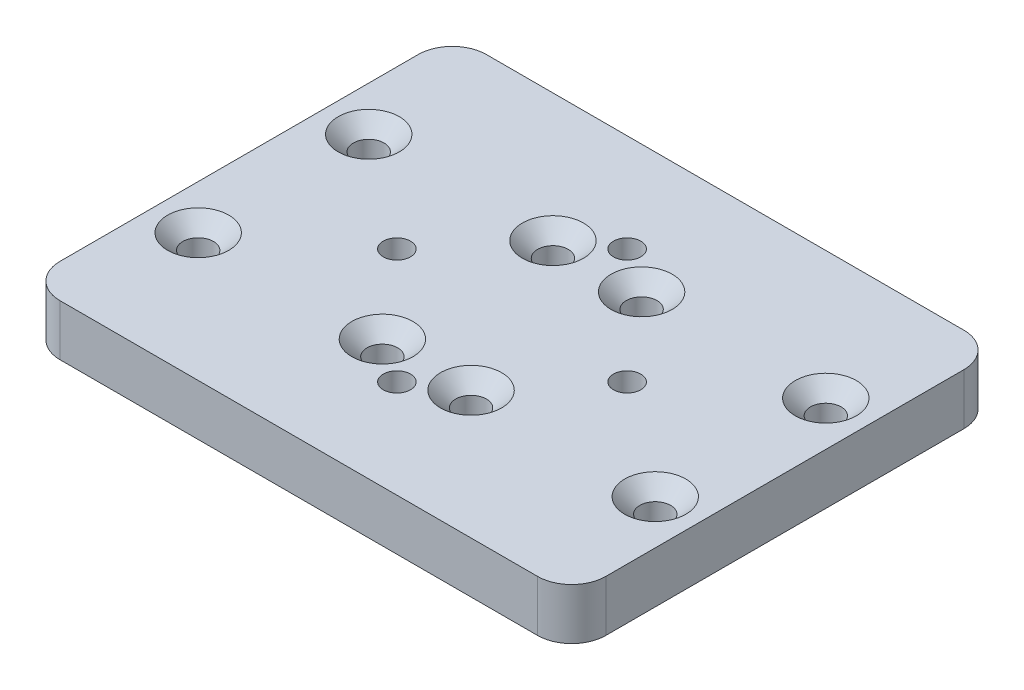
ISO-10303-21;
HEADER;
FILE_DESCRIPTION(('STEP AP214'),'2;1');
FILE_NAME('part.step','',(''),(''),'','','');
FILE_SCHEMA(('AUTOMOTIVE_DESIGN { 1 0 10303 214 1 1 1 1 }'));
ENDSEC;
DATA;
#1=APPLICATION_CONTEXT('core data for automotive mechanical design processes');
#2=APPLICATION_PROTOCOL_DEFINITION('international standard','automotive_design',2000,#1);
#3=PRODUCT_CONTEXT('',#1,'mechanical');
#4=PRODUCT('Part','Part','',(#3));
#5=PRODUCT_RELATED_PRODUCT_CATEGORY('part','',(#4));
#6=PRODUCT_DEFINITION_FORMATION('','',#4);
#7=PRODUCT_DEFINITION_CONTEXT('part definition',#1,'design');
#8=PRODUCT_DEFINITION('design','',#6,#7);
#9=PRODUCT_DEFINITION_SHAPE('','',#8);
#10=(LENGTH_UNIT() NAMED_UNIT(*) SI_UNIT(.MILLI.,.METRE.));
#11=(NAMED_UNIT(*) PLANE_ANGLE_UNIT() SI_UNIT($,.RADIAN.));
#12=(NAMED_UNIT(*) SI_UNIT($,.STERADIAN.) SOLID_ANGLE_UNIT());
#13=UNCERTAINTY_MEASURE_WITH_UNIT(LENGTH_MEASURE(1.E-05),#10,'distance_accuracy_value','');
#14=(GEOMETRIC_REPRESENTATION_CONTEXT(3) GLOBAL_UNCERTAINTY_ASSIGNED_CONTEXT((#13)) GLOBAL_UNIT_ASSIGNED_CONTEXT((#10,
#11,#12)) REPRESENTATION_CONTEXT('',''));
#15=CARTESIAN_POINT('',(0.,0.,0.));
#16=DIRECTION('',(0.,0.,1.));
#17=DIRECTION('',(1.,0.,0.));
#18=AXIS2_PLACEMENT_3D('',#15,#16,#17);
#19=CARTESIAN_POINT('',(-70.,15.,52.5));
#20=DIRECTION('',(0.,-1.,0.));
#21=DIRECTION('',(0.,0.,-1.));
#22=AXIS2_PLACEMENT_3D('',#19,#20,#21);
#23=CYLINDRICAL_SURFACE('',#22,9.99999999999999);
#24=CARTESIAN_POINT('',(-70.,0.,52.5));
#25=DIRECTION('',(0.,1.,0.));
#26=DIRECTION('',(0.,0.,-1.));
#27=AXIS2_PLACEMENT_3D('',#24,#25,#26);
#28=CIRCLE('',#27,9.99999999999999);
#29=CARTESIAN_POINT('',(-80.,0.,52.4999999999999));
#30=VERTEX_POINT('',#29);
#31=CARTESIAN_POINT('',(-70.,0.,62.5));
#32=VERTEX_POINT('',#31);
#33=EDGE_CURVE('E143',#30,#32,#28,.T.);
#34=ORIENTED_EDGE('',*,*,#33,.T.);
#35=DIRECTION('',(0.,-1.,0.));
#36=VECTOR('',#35,1.);
#37=CARTESIAN_POINT('',(-70.,15.,62.5));
#38=LINE('',#37,#36);
#39=CARTESIAN_POINT('',(-70.,15.,62.5));
#40=VERTEX_POINT('',#39);
#41=EDGE_CURVE('E11',#40,#32,#38,.T.);
#42=ORIENTED_EDGE('',*,*,#41,.F.);
#43=CARTESIAN_POINT('',(-70.,15.,52.5));
#44=DIRECTION('',(0.,1.,0.));
#45=DIRECTION('',(0.,0.,-1.));
#46=AXIS2_PLACEMENT_3D('',#43,#44,#45);
#47=CIRCLE('',#46,9.99999999999999);
#48=CARTESIAN_POINT('',(-80.,15.,52.4999999999999));
#49=VERTEX_POINT('',#48);
#50=EDGE_CURVE('E166',#49,#40,#47,.T.);
#51=ORIENTED_EDGE('',*,*,#50,.F.);
#52=DIRECTION('',(0.,-1.,0.));
#53=VECTOR('',#52,1.);
#54=CARTESIAN_POINT('',(-80.,15.,52.4999999999999));
#55=LINE('',#54,#53);
#56=EDGE_CURVE('E139',#49,#30,#55,.T.);
#57=ORIENTED_EDGE('',*,*,#56,.T.);
#58=EDGE_LOOP('',(#34,#42,#51,#57));
#59=FACE_BOUND('',#58,.T.);
#60=ADVANCED_FACE('F42',(#59),#23,.T.);
#61=CARTESIAN_POINT('',(-70.,15.,62.5));
#62=DIRECTION('',(0.,0.,-1.));
#63=DIRECTION('',(-1.,0.,0.));
#64=AXIS2_PLACEMENT_3D('',#61,#62,#63);
#65=PLANE('',#64);
#66=DIRECTION('',(1.,0.,0.));
#67=VECTOR('',#66,1.);
#68=CARTESIAN_POINT('',(-70.,0.,62.5));
#69=LINE('',#68,#67);
#70=CARTESIAN_POINT('',(69.9999999999999,0.,62.5));
#71=VERTEX_POINT('',#70);
#72=EDGE_CURVE('E147',#32,#71,#69,.T.);
#73=ORIENTED_EDGE('',*,*,#72,.T.);
#74=DIRECTION('',(0.,-1.,0.));
#75=VECTOR('',#74,1.);
#76=CARTESIAN_POINT('',(69.9999999999999,15.,62.5));
#77=LINE('',#76,#75);
#78=CARTESIAN_POINT('',(69.9999999999999,15.,62.5));
#79=VERTEX_POINT('',#78);
#80=EDGE_CURVE('E51',#79,#71,#77,.T.);
#81=ORIENTED_EDGE('',*,*,#80,.F.);
#82=DIRECTION('',(1.,0.,0.));
#83=VECTOR('',#82,1.);
#84=CARTESIAN_POINT('',(-70.,15.,62.5));
#85=LINE('',#84,#83);
#86=EDGE_CURVE('E102',#40,#79,#85,.T.);
#87=ORIENTED_EDGE('',*,*,#86,.F.);
#88=ORIENTED_EDGE('',*,*,#41,.T.);
#89=EDGE_LOOP('',(#73,#81,#87,#88));
#90=FACE_BOUND('',#89,.T.);
#91=ADVANCED_FACE('F390',(#90),#65,.F.);
#92=CARTESIAN_POINT('',(70.,15.,52.5));
#93=DIRECTION('',(0.,-1.,0.));
#94=DIRECTION('',(0.,0.,-1.));
#95=AXIS2_PLACEMENT_3D('',#92,#93,#94);
#96=CYLINDRICAL_SURFACE('',#95,9.99999999999999);
#97=CARTESIAN_POINT('',(70.,0.,52.5));
#98=DIRECTION('',(0.,1.,0.));
#99=DIRECTION('',(0.,0.,1.));
#100=AXIS2_PLACEMENT_3D('',#97,#98,#99);
#101=CIRCLE('',#100,9.99999999999999);
#102=CARTESIAN_POINT('',(80.,0.,52.4999999999999));
#103=VERTEX_POINT('',#102);
#104=EDGE_CURVE('E151',#71,#103,#101,.T.);
#105=ORIENTED_EDGE('',*,*,#104,.T.);
#106=DIRECTION('',(0.,-1.,0.));
#107=VECTOR('',#106,1.);
#108=CARTESIAN_POINT('',(80.,15.,52.4999999999999));
#109=LINE('',#108,#107);
#110=CARTESIAN_POINT('',(80.,15.,52.4999999999999));
#111=VERTEX_POINT('',#110);
#112=EDGE_CURVE('E177',#111,#103,#109,.T.);
#113=ORIENTED_EDGE('',*,*,#112,.F.);
#114=CARTESIAN_POINT('',(70.,15.,52.5));
#115=DIRECTION('',(0.,1.,0.));
#116=DIRECTION('',(0.,0.,1.));
#117=AXIS2_PLACEMENT_3D('',#114,#115,#116);
#118=CIRCLE('',#117,9.99999999999999);
#119=EDGE_CURVE('E187',#79,#111,#118,.T.);
#120=ORIENTED_EDGE('',*,*,#119,.F.);
#121=ORIENTED_EDGE('',*,*,#80,.T.);
#122=EDGE_LOOP('',(#105,#113,#120,#121));
#123=FACE_BOUND('',#122,.T.);
#124=ADVANCED_FACE('F185',(#123),#96,.T.);
#125=CARTESIAN_POINT('',(80.,15.,52.4999999999999));
#126=DIRECTION('',(-1.,0.,0.));
#127=DIRECTION('',(0.,0.,1.));
#128=AXIS2_PLACEMENT_3D('',#125,#126,#127);
#129=PLANE('',#128);
#130=DIRECTION('',(0.,0.,-1.));
#131=VECTOR('',#130,1.);
#132=CARTESIAN_POINT('',(80.,0.,52.4999999999999));
#133=LINE('',#132,#131);
#134=CARTESIAN_POINT('',(80.,0.,-52.4999999999999));
#135=VERTEX_POINT('',#134);
#136=EDGE_CURVE('E154',#103,#135,#133,.T.);
#137=ORIENTED_EDGE('',*,*,#136,.T.);
#138=DIRECTION('',(0.,-1.,0.));
#139=VECTOR('',#138,1.);
#140=CARTESIAN_POINT('',(80.,15.,-52.4999999999999));
#141=LINE('',#140,#139);
#142=CARTESIAN_POINT('',(80.,15.,-52.4999999999999));
#143=VERTEX_POINT('',#142);
#144=EDGE_CURVE('E173',#143,#135,#141,.T.);
#145=ORIENTED_EDGE('',*,*,#144,.F.);
#146=DIRECTION('',(0.,0.,-1.));
#147=VECTOR('',#146,1.);
#148=CARTESIAN_POINT('',(80.,15.,52.4999999999999));
#149=LINE('',#148,#147);
#150=EDGE_CURVE('E200',#111,#143,#149,.T.);
#151=ORIENTED_EDGE('',*,*,#150,.F.);
#152=ORIENTED_EDGE('',*,*,#112,.T.);
#153=EDGE_LOOP('',(#137,#145,#151,#152));
#154=FACE_BOUND('',#153,.T.);
#155=ADVANCED_FACE('F195',(#154),#129,.F.);
#156=CARTESIAN_POINT('',(70.,15.,-52.5));
#157=DIRECTION('',(0.,-1.,0.));
#158=DIRECTION('',(0.,0.,-1.));
#159=AXIS2_PLACEMENT_3D('',#156,#157,#158);
#160=CYLINDRICAL_SURFACE('',#159,9.99999999999999);
#161=CARTESIAN_POINT('',(70.,0.,-52.5));
#162=DIRECTION('',(0.,1.,0.));
#163=DIRECTION('',(0.,0.,-1.));
#164=AXIS2_PLACEMENT_3D('',#161,#162,#163);
#165=CIRCLE('',#164,9.99999999999999);
#166=CARTESIAN_POINT('',(69.9999999999999,0.,-62.5));
#167=VERTEX_POINT('',#166);
#168=EDGE_CURVE('E157',#135,#167,#165,.T.);
#169=ORIENTED_EDGE('',*,*,#168,.T.);
#170=DIRECTION('',(0.,-1.,0.));
#171=VECTOR('',#170,1.);
#172=CARTESIAN_POINT('',(69.9999999999999,15.,-62.5));
#173=LINE('',#172,#171);
#174=CARTESIAN_POINT('',(69.9999999999999,15.,-62.5));
#175=VERTEX_POINT('',#174);
#176=EDGE_CURVE('E132',#175,#167,#173,.T.);
#177=ORIENTED_EDGE('',*,*,#176,.F.);
#178=CARTESIAN_POINT('',(70.,15.,-52.5));
#179=DIRECTION('',(0.,1.,0.));
#180=DIRECTION('',(0.,0.,-1.));
#181=AXIS2_PLACEMENT_3D('',#178,#179,#180);
#182=CIRCLE('',#181,9.99999999999999);
#183=EDGE_CURVE('E121',#143,#175,#182,.T.);
#184=ORIENTED_EDGE('',*,*,#183,.F.);
#185=ORIENTED_EDGE('',*,*,#144,.T.);
#186=EDGE_LOOP('',(#169,#177,#184,#185));
#187=FACE_BOUND('',#186,.T.);
#188=ADVANCED_FACE('F198',(#187),#160,.T.);
#189=CARTESIAN_POINT('',(-70.,15.,-62.5));
#190=DIRECTION('',(0.,0.,1.));
#191=DIRECTION('',(1.,0.,0.));
#192=AXIS2_PLACEMENT_3D('',#189,#190,#191);
#193=PLANE('',#192);
#194=DIRECTION('',(-1.,0.,0.));
#195=VECTOR('',#194,1.);
#196=CARTESIAN_POINT('',(-70.,0.,-62.5));
#197=LINE('',#196,#195);
#198=CARTESIAN_POINT('',(-70.,0.,-62.5));
#199=VERTEX_POINT('',#198);
#200=EDGE_CURVE('E130',#167,#199,#197,.T.);
#201=ORIENTED_EDGE('',*,*,#200,.T.);
#202=DIRECTION('',(0.,-1.,0.));
#203=VECTOR('',#202,1.);
#204=CARTESIAN_POINT('',(-70.,15.,-62.5));
#205=LINE('',#204,#203);
#206=CARTESIAN_POINT('',(-70.,15.,-62.5));
#207=VERTEX_POINT('',#206);
#208=EDGE_CURVE('E127',#207,#199,#205,.T.);
#209=ORIENTED_EDGE('',*,*,#208,.F.);
#210=DIRECTION('',(-1.,0.,0.));
#211=VECTOR('',#210,1.);
#212=CARTESIAN_POINT('',(-70.,15.,-62.5));
#213=LINE('',#212,#211);
#214=EDGE_CURVE('E115',#175,#207,#213,.T.);
#215=ORIENTED_EDGE('',*,*,#214,.F.);
#216=ORIENTED_EDGE('',*,*,#176,.T.);
#217=EDGE_LOOP('',(#201,#209,#215,#216));
#218=FACE_BOUND('',#217,.T.);
#219=ADVANCED_FACE('F128',(#218),#193,.F.);
#220=CARTESIAN_POINT('',(-70.,15.,-52.5));
#221=DIRECTION('',(0.,-1.,0.));
#222=DIRECTION('',(0.,0.,-1.));
#223=AXIS2_PLACEMENT_3D('',#220,#221,#222);
#224=CYLINDRICAL_SURFACE('',#223,9.99999999999999);
#225=CARTESIAN_POINT('',(-70.,0.,-52.5));
#226=DIRECTION('',(0.,1.,0.));
#227=DIRECTION('',(0.,0.,-1.));
#228=AXIS2_PLACEMENT_3D('',#225,#226,#227);
#229=CIRCLE('',#228,9.99999999999999);
#230=CARTESIAN_POINT('',(-80.,0.,-52.4999999999999));
#231=VERTEX_POINT('',#230);
#232=EDGE_CURVE('E88',#199,#231,#229,.T.);
#233=ORIENTED_EDGE('',*,*,#232,.T.);
#234=DIRECTION('',(0.,-1.,0.));
#235=VECTOR('',#234,1.);
#236=CARTESIAN_POINT('',(-80.,15.,-52.4999999999999));
#237=LINE('',#236,#235);
#238=CARTESIAN_POINT('',(-80.,15.,-52.4999999999999));
#239=VERTEX_POINT('',#238);
#240=EDGE_CURVE('E133',#239,#231,#237,.T.);
#241=ORIENTED_EDGE('',*,*,#240,.F.);
#242=CARTESIAN_POINT('',(-70.,15.,-52.5));
#243=DIRECTION('',(0.,1.,0.));
#244=DIRECTION('',(0.,0.,-1.));
#245=AXIS2_PLACEMENT_3D('',#242,#243,#244);
#246=CIRCLE('',#245,9.99999999999999);
#247=EDGE_CURVE('E119',#207,#239,#246,.T.);
#248=ORIENTED_EDGE('',*,*,#247,.F.);
#249=ORIENTED_EDGE('',*,*,#208,.T.);
#250=EDGE_LOOP('',(#233,#241,#248,#249));
#251=FACE_BOUND('',#250,.T.);
#252=ADVANCED_FACE('F135',(#251),#224,.T.);
#253=CARTESIAN_POINT('',(-80.,15.,52.4999999999999));
#254=DIRECTION('',(1.,0.,0.));
#255=DIRECTION('',(0.,0.,-1.));
#256=AXIS2_PLACEMENT_3D('',#253,#254,#255);
#257=PLANE('',#256);
#258=DIRECTION('',(0.,0.,1.));
#259=VECTOR('',#258,1.);
#260=CARTESIAN_POINT('',(-80.,0.,52.4999999999999));
#261=LINE('',#260,#259);
#262=EDGE_CURVE('E94',#231,#30,#261,.T.);
#263=ORIENTED_EDGE('',*,*,#262,.T.);
#264=ORIENTED_EDGE('',*,*,#56,.F.);
#265=DIRECTION('',(0.,0.,1.));
#266=VECTOR('',#265,1.);
#267=CARTESIAN_POINT('',(-80.,15.,52.4999999999999));
#268=LINE('',#267,#266);
#269=EDGE_CURVE('E59',#239,#49,#268,.T.);
#270=ORIENTED_EDGE('',*,*,#269,.F.);
#271=ORIENTED_EDGE('',*,*,#240,.T.);
#272=EDGE_LOOP('',(#263,#264,#270,#271));
#273=FACE_BOUND('',#272,.T.);
#274=ADVANCED_FACE('F349',(#273),#257,.F.);
#275=CARTESIAN_POINT('',(-70.,15.,52.5));
#276=DIRECTION('',(0.,-1.,0.));
#277=DIRECTION('',(0.,0.,-1.));
#278=AXIS2_PLACEMENT_3D('',#275,#276,#277);
#279=PLANE('',#278);
#280=CARTESIAN_POINT('',(0.,15.,-33.75));
#281=DIRECTION('',(0.,1.,0.));
#282=DIRECTION('',(0.,0.,1.));
#283=AXIS2_PLACEMENT_3D('',#280,#281,#282);
#284=CIRCLE('',#283,4.);
#285=CARTESIAN_POINT('',(0.,15.,-29.75));
#286=VERTEX_POINT('',#285);
#287=EDGE_CURVE('E330',#286,#286,#284,.T.);
#288=ORIENTED_EDGE('',*,*,#287,.F.);
#289=EDGE_LOOP('',(#288));
#290=FACE_BOUND('',#289,.T.);
#291=CARTESIAN_POINT('',(33.75,15.,0.));
#292=DIRECTION('',(0.,1.,0.));
#293=DIRECTION('',(0.,0.,1.));
#294=AXIS2_PLACEMENT_3D('',#291,#292,#293);
#295=CIRCLE('',#294,4.00000000000001);
#296=CARTESIAN_POINT('',(33.75,15.,4.00000000000001));
#297=VERTEX_POINT('',#296);
#298=EDGE_CURVE('E322',#297,#297,#295,.T.);
#299=ORIENTED_EDGE('',*,*,#298,.F.);
#300=EDGE_LOOP('',(#299));
#301=FACE_BOUND('',#300,.T.);
#302=CARTESIAN_POINT('',(0.,15.,33.75));
#303=DIRECTION('',(0.,1.,0.));
#304=DIRECTION('',(0.,0.,1.));
#305=AXIS2_PLACEMENT_3D('',#302,#303,#304);
#306=CIRCLE('',#305,4.);
#307=CARTESIAN_POINT('',(0.,15.,37.75));
#308=VERTEX_POINT('',#307);
#309=EDGE_CURVE('E314',#308,#308,#306,.T.);
#310=ORIENTED_EDGE('',*,*,#309,.F.);
#311=EDGE_LOOP('',(#310));
#312=FACE_BOUND('',#311,.T.);
#313=CARTESIAN_POINT('',(-33.75,15.,0.));
#314=DIRECTION('',(0.,1.,0.));
#315=DIRECTION('',(0.,0.,1.));
#316=AXIS2_PLACEMENT_3D('',#313,#314,#315);
#317=CIRCLE('',#316,4.00000000000001);
#318=CARTESIAN_POINT('',(-33.75,15.,4.));
#319=VERTEX_POINT('',#318);
#320=EDGE_CURVE('E306',#319,#319,#317,.T.);
#321=ORIENTED_EDGE('',*,*,#320,.F.);
#322=EDGE_LOOP('',(#321));
#323=FACE_BOUND('',#322,.T.);
#324=CARTESIAN_POINT('',(-67.,15.,-25.));
#325=DIRECTION('',(0.,1.,0.));
#326=DIRECTION('',(0.,0.,1.));
#327=AXIS2_PLACEMENT_3D('',#324,#325,#326);
#328=CIRCLE('',#327,8.96);
#329=CARTESIAN_POINT('',(-67.,15.,-16.04));
#330=VERTEX_POINT('',#329);
#331=EDGE_CURVE('E301',#330,#330,#328,.T.);
#332=ORIENTED_EDGE('',*,*,#331,.F.);
#333=EDGE_LOOP('',(#332));
#334=FACE_BOUND('',#333,.T.);
#335=CARTESIAN_POINT('',(-13.,15.,-25.));
#336=DIRECTION('',(0.,1.,0.));
#337=DIRECTION('',(0.,0.,1.));
#338=AXIS2_PLACEMENT_3D('',#335,#336,#337);
#339=CIRCLE('',#338,8.96);
#340=CARTESIAN_POINT('',(-13.,15.,-16.04));
#341=VERTEX_POINT('',#340);
#342=EDGE_CURVE('E289',#341,#341,#339,.T.);
#343=ORIENTED_EDGE('',*,*,#342,.F.);
#344=EDGE_LOOP('',(#343));
#345=FACE_BOUND('',#344,.T.);
#346=CARTESIAN_POINT('',(-13.,15.,25.));
#347=DIRECTION('',(0.,1.,0.));
#348=DIRECTION('',(0.,0.,1.));
#349=AXIS2_PLACEMENT_3D('',#346,#347,#348);
#350=CIRCLE('',#349,8.96);
#351=CARTESIAN_POINT('',(-13.,15.,33.96));
#352=VERTEX_POINT('',#351);
#353=EDGE_CURVE('E277',#352,#352,#350,.T.);
#354=ORIENTED_EDGE('',*,*,#353,.F.);
#355=EDGE_LOOP('',(#354));
#356=FACE_BOUND('',#355,.T.);
#357=CARTESIAN_POINT('',(13.,15.,25.));
#358=DIRECTION('',(0.,1.,0.));
#359=DIRECTION('',(0.,0.,1.));
#360=AXIS2_PLACEMENT_3D('',#357,#358,#359);
#361=CIRCLE('',#360,8.96);
#362=CARTESIAN_POINT('',(13.,15.,33.96));
#363=VERTEX_POINT('',#362);
#364=EDGE_CURVE('E265',#363,#363,#361,.T.);
#365=ORIENTED_EDGE('',*,*,#364,.F.);
#366=EDGE_LOOP('',(#365));
#367=FACE_BOUND('',#366,.T.);
#368=CARTESIAN_POINT('',(13.,15.,-25.));
#369=DIRECTION('',(0.,1.,0.));
#370=DIRECTION('',(0.,0.,1.));
#371=AXIS2_PLACEMENT_3D('',#368,#369,#370);
#372=CIRCLE('',#371,8.96);
#373=CARTESIAN_POINT('',(13.,15.,-16.04));
#374=VERTEX_POINT('',#373);
#375=EDGE_CURVE('E253',#374,#374,#372,.T.);
#376=ORIENTED_EDGE('',*,*,#375,.F.);
#377=EDGE_LOOP('',(#376));
#378=FACE_BOUND('',#377,.T.);
#379=CARTESIAN_POINT('',(67.,15.,-25.));
#380=DIRECTION('',(0.,1.,0.));
#381=DIRECTION('',(0.,0.,1.));
#382=AXIS2_PLACEMENT_3D('',#379,#380,#381);
#383=CIRCLE('',#382,8.96);
#384=CARTESIAN_POINT('',(67.,15.,-16.04));
#385=VERTEX_POINT('',#384);
#386=EDGE_CURVE('E241',#385,#385,#383,.T.);
#387=ORIENTED_EDGE('',*,*,#386,.F.);
#388=EDGE_LOOP('',(#387));
#389=FACE_BOUND('',#388,.T.);
#390=CARTESIAN_POINT('',(67.,15.,25.));
#391=DIRECTION('',(0.,1.,0.));
#392=DIRECTION('',(0.,0.,1.));
#393=AXIS2_PLACEMENT_3D('',#390,#391,#392);
#394=CIRCLE('',#393,8.96);
#395=CARTESIAN_POINT('',(67.,15.,33.96));
#396=VERTEX_POINT('',#395);
#397=EDGE_CURVE('E229',#396,#396,#394,.T.);
#398=ORIENTED_EDGE('',*,*,#397,.F.);
#399=EDGE_LOOP('',(#398));
#400=FACE_BOUND('',#399,.T.);
#401=CARTESIAN_POINT('',(-67.,15.,25.));
#402=DIRECTION('',(0.,1.,0.));
#403=DIRECTION('',(0.,0.,1.));
#404=AXIS2_PLACEMENT_3D('',#401,#402,#403);
#405=CIRCLE('',#404,8.96);
#406=CARTESIAN_POINT('',(-67.,15.,33.96));
#407=VERTEX_POINT('',#406);
#408=EDGE_CURVE('E217',#407,#407,#405,.T.);
#409=ORIENTED_EDGE('',*,*,#408,.F.);
#410=EDGE_LOOP('',(#409));
#411=FACE_BOUND('',#410,.T.);
#412=ORIENTED_EDGE('',*,*,#50,.T.);
#413=ORIENTED_EDGE('',*,*,#86,.T.);
#414=ORIENTED_EDGE('',*,*,#119,.T.);
#415=ORIENTED_EDGE('',*,*,#150,.T.);
#416=ORIENTED_EDGE('',*,*,#183,.T.);
#417=ORIENTED_EDGE('',*,*,#214,.T.);
#418=ORIENTED_EDGE('',*,*,#247,.T.);
#419=ORIENTED_EDGE('',*,*,#269,.T.);
#420=EDGE_LOOP('',(#412,#413,#414,#415,#416,#417,#418,#419));
#421=FACE_BOUND('',#420,.T.);
#422=ADVANCED_FACE('F117',(#290,#301,#312,#323,#334,#345,#356,#367,#378,#389,#400,#411,#421),
#279,.F.);
#423=CARTESIAN_POINT('',(-70.,0.,52.5));
#424=DIRECTION('',(0.,-1.,0.));
#425=DIRECTION('',(0.,0.,-1.));
#426=AXIS2_PLACEMENT_3D('',#423,#424,#425);
#427=PLANE('',#426);
#428=CARTESIAN_POINT('',(0.,0.,-33.75));
#429=DIRECTION('',(0.,1.,0.));
#430=DIRECTION('',(0.,0.,1.));
#431=AXIS2_PLACEMENT_3D('',#428,#429,#430);
#432=CIRCLE('',#431,4.);
#433=CARTESIAN_POINT('',(0.,0.,-29.75));
#434=VERTEX_POINT('',#433);
#435=EDGE_CURVE('E305',#434,#434,#432,.T.);
#436=ORIENTED_EDGE('',*,*,#435,.T.);
#437=EDGE_LOOP('',(#436));
#438=FACE_BOUND('',#437,.T.);
#439=CARTESIAN_POINT('',(33.75,0.,0.));
#440=DIRECTION('',(0.,1.,0.));
#441=DIRECTION('',(0.,0.,1.));
#442=AXIS2_PLACEMENT_3D('',#439,#440,#441);
#443=CIRCLE('',#442,4.00000000000001);
#444=CARTESIAN_POINT('',(33.75,0.,4.00000000000001));
#445=VERTEX_POINT('',#444);
#446=EDGE_CURVE('E326',#445,#445,#443,.T.);
#447=ORIENTED_EDGE('',*,*,#446,.T.);
#448=EDGE_LOOP('',(#447));
#449=FACE_BOUND('',#448,.T.);
#450=CARTESIAN_POINT('',(0.,0.,33.75));
#451=DIRECTION('',(0.,1.,0.));
#452=DIRECTION('',(0.,0.,1.));
#453=AXIS2_PLACEMENT_3D('',#450,#451,#452);
#454=CIRCLE('',#453,4.);
#455=CARTESIAN_POINT('',(0.,0.,37.75));
#456=VERTEX_POINT('',#455);
#457=EDGE_CURVE('E318',#456,#456,#454,.T.);
#458=ORIENTED_EDGE('',*,*,#457,.T.);
#459=EDGE_LOOP('',(#458));
#460=FACE_BOUND('',#459,.T.);
#461=CARTESIAN_POINT('',(-33.75,0.,0.));
#462=DIRECTION('',(0.,1.,0.));
#463=DIRECTION('',(0.,0.,1.));
#464=AXIS2_PLACEMENT_3D('',#461,#462,#463);
#465=CIRCLE('',#464,4.00000000000001);
#466=CARTESIAN_POINT('',(-33.75,0.,4.));
#467=VERTEX_POINT('',#466);
#468=EDGE_CURVE('E310',#467,#467,#465,.T.);
#469=ORIENTED_EDGE('',*,*,#468,.T.);
#470=EDGE_LOOP('',(#469));
#471=FACE_BOUND('',#470,.T.);
#472=CARTESIAN_POINT('',(-67.,0.,25.));
#473=DIRECTION('',(0.,1.,0.));
#474=DIRECTION('',(0.,0.,1.));
#475=AXIS2_PLACEMENT_3D('',#472,#473,#474);
#476=CIRCLE('',#475,4.5);
#477=CARTESIAN_POINT('',(-67.,0.,29.5));
#478=VERTEX_POINT('',#477);
#479=EDGE_CURVE('E148',#478,#478,#476,.T.);
#480=ORIENTED_EDGE('',*,*,#479,.T.);
#481=EDGE_LOOP('',(#480));
#482=FACE_BOUND('',#481,.T.);
#483=CARTESIAN_POINT('',(-13.,0.,25.));
#484=DIRECTION('',(0.,1.,0.));
#485=DIRECTION('',(0.,0.,1.));
#486=AXIS2_PLACEMENT_3D('',#483,#484,#485);
#487=CIRCLE('',#486,4.5);
#488=CARTESIAN_POINT('',(-13.,0.,29.5));
#489=VERTEX_POINT('',#488);
#490=EDGE_CURVE('E269',#489,#489,#487,.T.);
#491=ORIENTED_EDGE('',*,*,#490,.T.);
#492=EDGE_LOOP('',(#491));
#493=FACE_BOUND('',#492,.T.);
#494=CARTESIAN_POINT('',(13.,0.,25.));
#495=DIRECTION('',(0.,1.,0.));
#496=DIRECTION('',(0.,0.,1.));
#497=AXIS2_PLACEMENT_3D('',#494,#495,#496);
#498=CIRCLE('',#497,4.5);
#499=CARTESIAN_POINT('',(13.,0.,29.5));
#500=VERTEX_POINT('',#499);
#501=EDGE_CURVE('E257',#500,#500,#498,.T.);
#502=ORIENTED_EDGE('',*,*,#501,.T.);
#503=EDGE_LOOP('',(#502));
#504=FACE_BOUND('',#503,.T.);
#505=CARTESIAN_POINT('',(67.,0.,25.));
#506=DIRECTION('',(0.,1.,0.));
#507=DIRECTION('',(0.,0.,1.));
#508=AXIS2_PLACEMENT_3D('',#505,#506,#507);
#509=CIRCLE('',#508,4.49999999999999);
#510=CARTESIAN_POINT('',(67.,0.,29.5));
#511=VERTEX_POINT('',#510);
#512=EDGE_CURVE('E221',#511,#511,#509,.T.);
#513=ORIENTED_EDGE('',*,*,#512,.T.);
#514=EDGE_LOOP('',(#513));
#515=FACE_BOUND('',#514,.T.);
#516=CARTESIAN_POINT('',(67.,0.,-25.));
#517=DIRECTION('',(0.,1.,0.));
#518=DIRECTION('',(0.,0.,1.));
#519=AXIS2_PLACEMENT_3D('',#516,#517,#518);
#520=CIRCLE('',#519,4.49999999999999);
#521=CARTESIAN_POINT('',(67.,0.,-20.5));
#522=VERTEX_POINT('',#521);
#523=EDGE_CURVE('E233',#522,#522,#520,.T.);
#524=ORIENTED_EDGE('',*,*,#523,.T.);
#525=EDGE_LOOP('',(#524));
#526=FACE_BOUND('',#525,.T.);
#527=CARTESIAN_POINT('',(13.,0.,-25.));
#528=DIRECTION('',(0.,1.,0.));
#529=DIRECTION('',(0.,0.,1.));
#530=AXIS2_PLACEMENT_3D('',#527,#528,#529);
#531=CIRCLE('',#530,4.5);
#532=CARTESIAN_POINT('',(13.,0.,-20.5));
#533=VERTEX_POINT('',#532);
#534=EDGE_CURVE('E245',#533,#533,#531,.T.);
#535=ORIENTED_EDGE('',*,*,#534,.T.);
#536=EDGE_LOOP('',(#535));
#537=FACE_BOUND('',#536,.T.);
#538=CARTESIAN_POINT('',(-13.,0.,-25.));
#539=DIRECTION('',(0.,1.,0.));
#540=DIRECTION('',(0.,0.,1.));
#541=AXIS2_PLACEMENT_3D('',#538,#539,#540);
#542=CIRCLE('',#541,4.5);
#543=CARTESIAN_POINT('',(-13.,0.,-20.5));
#544=VERTEX_POINT('',#543);
#545=EDGE_CURVE('E281',#544,#544,#542,.T.);
#546=ORIENTED_EDGE('',*,*,#545,.T.);
#547=EDGE_LOOP('',(#546));
#548=FACE_BOUND('',#547,.T.);
#549=CARTESIAN_POINT('',(-67.,0.,-25.));
#550=DIRECTION('',(0.,1.,0.));
#551=DIRECTION('',(0.,0.,1.));
#552=AXIS2_PLACEMENT_3D('',#549,#550,#551);
#553=CIRCLE('',#552,4.5);
#554=CARTESIAN_POINT('',(-67.,0.,-20.5));
#555=VERTEX_POINT('',#554);
#556=EDGE_CURVE('E293',#555,#555,#553,.T.);
#557=ORIENTED_EDGE('',*,*,#556,.T.);
#558=EDGE_LOOP('',(#557));
#559=FACE_BOUND('',#558,.T.);
#560=ORIENTED_EDGE('',*,*,#33,.F.);
#561=ORIENTED_EDGE('',*,*,#262,.F.);
#562=ORIENTED_EDGE('',*,*,#232,.F.);
#563=ORIENTED_EDGE('',*,*,#200,.F.);
#564=ORIENTED_EDGE('',*,*,#168,.F.);
#565=ORIENTED_EDGE('',*,*,#136,.F.);
#566=ORIENTED_EDGE('',*,*,#104,.F.);
#567=ORIENTED_EDGE('',*,*,#72,.F.);
#568=EDGE_LOOP('',(#560,#561,#562,#563,#564,#565,#566,#567));
#569=FACE_BOUND('',#568,.T.);
#570=ADVANCED_FACE('F191',(#438,#449,#460,#471,#482,#493,#504,#515,#526,#537,#548,#559,#569),
#427,.T.);
#571=CARTESIAN_POINT('',(-67.,15.,25.));
#572=DIRECTION('',(0.,1.,0.));
#573=DIRECTION('',(0.,0.,1.));
#574=AXIS2_PLACEMENT_3D('',#571,#572,#573);
#575=CYLINDRICAL_SURFACE('',#574,4.5);
#576=ORIENTED_EDGE('',*,*,#479,.F.);
#577=EDGE_LOOP('',(#576));
#578=FACE_BOUND('',#577,.T.);
#579=CARTESIAN_POINT('',(-67.,10.54,25.));
#580=DIRECTION('',(0.,1.,0.));
#581=DIRECTION('',(0.,0.,1.));
#582=AXIS2_PLACEMENT_3D('',#579,#580,#581);
#583=CIRCLE('',#582,4.5);
#584=CARTESIAN_POINT('',(-67.,10.54,29.5));
#585=VERTEX_POINT('',#584);
#586=EDGE_CURVE('E213',#585,#585,#583,.T.);
#587=ORIENTED_EDGE('',*,*,#586,.T.);
#588=EDGE_LOOP('',(#587));
#589=FACE_BOUND('',#588,.T.);
#590=ADVANCED_FACE('F376',(#578,#589),#575,.F.);
#591=CARTESIAN_POINT('',(-67.,15.,25.));
#592=DIRECTION('',(0.,1.,0.));
#593=DIRECTION('',(0.,0.,1.));
#594=AXIS2_PLACEMENT_3D('',#591,#592,#593);
#595=CONICAL_SURFACE('',#594,8.96,0.785398163397449);
#596=ORIENTED_EDGE('',*,*,#586,.F.);
#597=EDGE_LOOP('',(#596));
#598=FACE_BOUND('',#597,.T.);
#599=ORIENTED_EDGE('',*,*,#408,.T.);
#600=EDGE_LOOP('',(#599));
#601=FACE_BOUND('',#600,.T.);
#602=ADVANCED_FACE('F373',(#598,#601),#595,.F.);
#603=CARTESIAN_POINT('',(67.,15.,25.));
#604=DIRECTION('',(0.,1.,0.));
#605=DIRECTION('',(0.,0.,1.));
#606=AXIS2_PLACEMENT_3D('',#603,#604,#605);
#607=CYLINDRICAL_SURFACE('',#606,4.5);
#608=ORIENTED_EDGE('',*,*,#512,.F.);
#609=EDGE_LOOP('',(#608));
#610=FACE_BOUND('',#609,.T.);
#611=CARTESIAN_POINT('',(67.,10.54,25.));
#612=DIRECTION('',(0.,1.,0.));
#613=DIRECTION('',(0.,0.,1.));
#614=AXIS2_PLACEMENT_3D('',#611,#612,#613);
#615=CIRCLE('',#614,4.5);
#616=CARTESIAN_POINT('',(67.,10.54,29.5));
#617=VERTEX_POINT('',#616);
#618=EDGE_CURVE('E225',#617,#617,#615,.T.);
#619=ORIENTED_EDGE('',*,*,#618,.T.);
#620=EDGE_LOOP('',(#619));
#621=FACE_BOUND('',#620,.T.);
#622=ADVANCED_FACE('F375',(#610,#621),#607,.F.);
#623=CARTESIAN_POINT('',(67.,15.,25.));
#624=DIRECTION('',(0.,1.,0.));
#625=DIRECTION('',(0.,0.,1.));
#626=AXIS2_PLACEMENT_3D('',#623,#624,#625);
#627=CONICAL_SURFACE('',#626,8.96,0.785398163397447);
#628=ORIENTED_EDGE('',*,*,#618,.F.);
#629=EDGE_LOOP('',(#628));
#630=FACE_BOUND('',#629,.T.);
#631=ORIENTED_EDGE('',*,*,#397,.T.);
#632=EDGE_LOOP('',(#631));
#633=FACE_BOUND('',#632,.T.);
#634=ADVANCED_FACE('F383',(#630,#633),#627,.F.);
#635=CARTESIAN_POINT('',(67.,15.,-25.));
#636=DIRECTION('',(0.,1.,0.));
#637=DIRECTION('',(0.,0.,1.));
#638=AXIS2_PLACEMENT_3D('',#635,#636,#637);
#639=CYLINDRICAL_SURFACE('',#638,4.5);
#640=ORIENTED_EDGE('',*,*,#523,.F.);
#641=EDGE_LOOP('',(#640));
#642=FACE_BOUND('',#641,.T.);
#643=CARTESIAN_POINT('',(67.,10.54,-25.));
#644=DIRECTION('',(0.,1.,0.));
#645=DIRECTION('',(0.,0.,1.));
#646=AXIS2_PLACEMENT_3D('',#643,#644,#645);
#647=CIRCLE('',#646,4.5);
#648=CARTESIAN_POINT('',(67.,10.54,-20.5));
#649=VERTEX_POINT('',#648);
#650=EDGE_CURVE('E237',#649,#649,#647,.T.);
#651=ORIENTED_EDGE('',*,*,#650,.T.);
#652=EDGE_LOOP('',(#651));
#653=FACE_BOUND('',#652,.T.);
#654=ADVANCED_FACE('F472',(#642,#653),#639,.F.);
#655=CARTESIAN_POINT('',(67.,15.,-25.));
#656=DIRECTION('',(0.,1.,0.));
#657=DIRECTION('',(0.,0.,1.));
#658=AXIS2_PLACEMENT_3D('',#655,#656,#657);
#659=CONICAL_SURFACE('',#658,8.96,0.785398163397447);
#660=ORIENTED_EDGE('',*,*,#650,.F.);
#661=EDGE_LOOP('',(#660));
#662=FACE_BOUND('',#661,.T.);
#663=ORIENTED_EDGE('',*,*,#386,.T.);
#664=EDGE_LOOP('',(#663));
#665=FACE_BOUND('',#664,.T.);
#666=ADVANCED_FACE('F483',(#662,#665),#659,.F.);
#667=CARTESIAN_POINT('',(13.,15.,-25.));
#668=DIRECTION('',(0.,1.,0.));
#669=DIRECTION('',(0.,0.,1.));
#670=AXIS2_PLACEMENT_3D('',#667,#668,#669);
#671=CYLINDRICAL_SURFACE('',#670,4.5);
#672=ORIENTED_EDGE('',*,*,#534,.F.);
#673=EDGE_LOOP('',(#672));
#674=FACE_BOUND('',#673,.T.);
#675=CARTESIAN_POINT('',(13.,10.54,-25.));
#676=DIRECTION('',(0.,1.,0.));
#677=DIRECTION('',(0.,0.,1.));
#678=AXIS2_PLACEMENT_3D('',#675,#676,#677);
#679=CIRCLE('',#678,4.5);
#680=CARTESIAN_POINT('',(13.,10.54,-20.5));
#681=VERTEX_POINT('',#680);
#682=EDGE_CURVE('E249',#681,#681,#679,.T.);
#683=ORIENTED_EDGE('',*,*,#682,.T.);
#684=EDGE_LOOP('',(#683));
#685=FACE_BOUND('',#684,.T.);
#686=ADVANCED_FACE('F494',(#674,#685),#671,.F.);
#687=CARTESIAN_POINT('',(13.,15.,-25.));
#688=DIRECTION('',(0.,1.,0.));
#689=DIRECTION('',(0.,0.,1.));
#690=AXIS2_PLACEMENT_3D('',#687,#688,#689);
#691=CONICAL_SURFACE('',#690,8.96,0.785398163397449);
#692=ORIENTED_EDGE('',*,*,#682,.F.);
#693=EDGE_LOOP('',(#692));
#694=FACE_BOUND('',#693,.T.);
#695=ORIENTED_EDGE('',*,*,#375,.T.);
#696=EDGE_LOOP('',(#695));
#697=FACE_BOUND('',#696,.T.);
#698=ADVANCED_FACE('F506',(#694,#697),#691,.F.);
#699=CARTESIAN_POINT('',(13.,15.,25.));
#700=DIRECTION('',(0.,1.,0.));
#701=DIRECTION('',(0.,0.,1.));
#702=AXIS2_PLACEMENT_3D('',#699,#700,#701);
#703=CYLINDRICAL_SURFACE('',#702,4.5);
#704=ORIENTED_EDGE('',*,*,#501,.F.);
#705=EDGE_LOOP('',(#704));
#706=FACE_BOUND('',#705,.T.);
#707=CARTESIAN_POINT('',(13.,10.54,25.));
#708=DIRECTION('',(0.,1.,0.));
#709=DIRECTION('',(0.,0.,1.));
#710=AXIS2_PLACEMENT_3D('',#707,#708,#709);
#711=CIRCLE('',#710,4.5);
#712=CARTESIAN_POINT('',(13.,10.54,29.5));
#713=VERTEX_POINT('',#712);
#714=EDGE_CURVE('E261',#713,#713,#711,.T.);
#715=ORIENTED_EDGE('',*,*,#714,.T.);
#716=EDGE_LOOP('',(#715));
#717=FACE_BOUND('',#716,.T.);
#718=ADVANCED_FACE('F517',(#706,#717),#703,.F.);
#719=CARTESIAN_POINT('',(13.,15.,25.));
#720=DIRECTION('',(0.,1.,0.));
#721=DIRECTION('',(0.,0.,1.));
#722=AXIS2_PLACEMENT_3D('',#719,#720,#721);
#723=CONICAL_SURFACE('',#722,8.96,0.785398163397449);
#724=ORIENTED_EDGE('',*,*,#714,.F.);
#725=EDGE_LOOP('',(#724));
#726=FACE_BOUND('',#725,.T.);
#727=ORIENTED_EDGE('',*,*,#364,.T.);
#728=EDGE_LOOP('',(#727));
#729=FACE_BOUND('',#728,.T.);
#730=ADVANCED_FACE('F528',(#726,#729),#723,.F.);
#731=CARTESIAN_POINT('',(-13.,15.,25.));
#732=DIRECTION('',(0.,1.,0.));
#733=DIRECTION('',(0.,0.,1.));
#734=AXIS2_PLACEMENT_3D('',#731,#732,#733);
#735=CYLINDRICAL_SURFACE('',#734,4.5);
#736=ORIENTED_EDGE('',*,*,#490,.F.);
#737=EDGE_LOOP('',(#736));
#738=FACE_BOUND('',#737,.T.);
#739=CARTESIAN_POINT('',(-13.,10.54,25.));
#740=DIRECTION('',(0.,1.,0.));
#741=DIRECTION('',(0.,0.,1.));
#742=AXIS2_PLACEMENT_3D('',#739,#740,#741);
#743=CIRCLE('',#742,4.5);
#744=CARTESIAN_POINT('',(-13.,10.54,29.5));
#745=VERTEX_POINT('',#744);
#746=EDGE_CURVE('E273',#745,#745,#743,.T.);
#747=ORIENTED_EDGE('',*,*,#746,.T.);
#748=EDGE_LOOP('',(#747));
#749=FACE_BOUND('',#748,.T.);
#750=ADVANCED_FACE('F540',(#738,#749),#735,.F.);
#751=CARTESIAN_POINT('',(-13.,15.,25.));
#752=DIRECTION('',(0.,1.,0.));
#753=DIRECTION('',(0.,0.,1.));
#754=AXIS2_PLACEMENT_3D('',#751,#752,#753);
#755=CONICAL_SURFACE('',#754,8.96,0.785398163397449);
#756=ORIENTED_EDGE('',*,*,#746,.F.);
#757=EDGE_LOOP('',(#756));
#758=FACE_BOUND('',#757,.T.);
#759=ORIENTED_EDGE('',*,*,#353,.T.);
#760=EDGE_LOOP('',(#759));
#761=FACE_BOUND('',#760,.T.);
#762=ADVANCED_FACE('F550',(#758,#761),#755,.F.);
#763=CARTESIAN_POINT('',(-13.,15.,-25.));
#764=DIRECTION('',(0.,1.,0.));
#765=DIRECTION('',(0.,0.,1.));
#766=AXIS2_PLACEMENT_3D('',#763,#764,#765);
#767=CYLINDRICAL_SURFACE('',#766,4.5);
#768=ORIENTED_EDGE('',*,*,#545,.F.);
#769=EDGE_LOOP('',(#768));
#770=FACE_BOUND('',#769,.T.);
#771=CARTESIAN_POINT('',(-13.,10.54,-25.));
#772=DIRECTION('',(0.,1.,0.));
#773=DIRECTION('',(0.,0.,1.));
#774=AXIS2_PLACEMENT_3D('',#771,#772,#773);
#775=CIRCLE('',#774,4.5);
#776=CARTESIAN_POINT('',(-13.,10.54,-20.5));
#777=VERTEX_POINT('',#776);
#778=EDGE_CURVE('E285',#777,#777,#775,.T.);
#779=ORIENTED_EDGE('',*,*,#778,.T.);
#780=EDGE_LOOP('',(#779));
#781=FACE_BOUND('',#780,.T.);
#782=ADVANCED_FACE('F560',(#770,#781),#767,.F.);
#783=CARTESIAN_POINT('',(-13.,15.,-25.));
#784=DIRECTION('',(0.,1.,0.));
#785=DIRECTION('',(0.,0.,1.));
#786=AXIS2_PLACEMENT_3D('',#783,#784,#785);
#787=CONICAL_SURFACE('',#786,8.96,0.785398163397449);
#788=ORIENTED_EDGE('',*,*,#778,.F.);
#789=EDGE_LOOP('',(#788));
#790=FACE_BOUND('',#789,.T.);
#791=ORIENTED_EDGE('',*,*,#342,.T.);
#792=EDGE_LOOP('',(#791));
#793=FACE_BOUND('',#792,.T.);
#794=ADVANCED_FACE('F570',(#790,#793),#787,.F.);
#795=CARTESIAN_POINT('',(-67.,15.,-25.));
#796=DIRECTION('',(0.,1.,0.));
#797=DIRECTION('',(0.,0.,1.));
#798=AXIS2_PLACEMENT_3D('',#795,#796,#797);
#799=CYLINDRICAL_SURFACE('',#798,4.5);
#800=ORIENTED_EDGE('',*,*,#556,.F.);
#801=EDGE_LOOP('',(#800));
#802=FACE_BOUND('',#801,.T.);
#803=CARTESIAN_POINT('',(-67.,10.54,-25.));
#804=DIRECTION('',(0.,1.,0.));
#805=DIRECTION('',(0.,0.,1.));
#806=AXIS2_PLACEMENT_3D('',#803,#804,#805);
#807=CIRCLE('',#806,4.5);
#808=CARTESIAN_POINT('',(-67.,10.54,-20.5));
#809=VERTEX_POINT('',#808);
#810=EDGE_CURVE('E297',#809,#809,#807,.T.);
#811=ORIENTED_EDGE('',*,*,#810,.T.);
#812=EDGE_LOOP('',(#811));
#813=FACE_BOUND('',#812,.T.);
#814=ADVANCED_FACE('F580',(#802,#813),#799,.F.);
#815=CARTESIAN_POINT('',(-67.,15.,-25.));
#816=DIRECTION('',(0.,1.,0.));
#817=DIRECTION('',(0.,0.,1.));
#818=AXIS2_PLACEMENT_3D('',#815,#816,#817);
#819=CONICAL_SURFACE('',#818,8.96,0.785398163397449);
#820=ORIENTED_EDGE('',*,*,#810,.F.);
#821=EDGE_LOOP('',(#820));
#822=FACE_BOUND('',#821,.T.);
#823=ORIENTED_EDGE('',*,*,#331,.T.);
#824=EDGE_LOOP('',(#823));
#825=FACE_BOUND('',#824,.T.);
#826=ADVANCED_FACE('F590',(#822,#825),#819,.F.);
#827=CARTESIAN_POINT('',(-33.75,0.,0.));
#828=DIRECTION('',(0.,1.,0.));
#829=DIRECTION('',(0.,0.,1.));
#830=AXIS2_PLACEMENT_3D('',#827,#828,#829);
#831=CYLINDRICAL_SURFACE('',#830,4.00000000000001);
#832=ORIENTED_EDGE('',*,*,#468,.F.);
#833=EDGE_LOOP('',(#832));
#834=FACE_BOUND('',#833,.T.);
#835=ORIENTED_EDGE('',*,*,#320,.T.);
#836=EDGE_LOOP('',(#835));
#837=FACE_BOUND('',#836,.T.);
#838=ADVANCED_FACE('F600',(#834,#837),#831,.F.);
#839=CARTESIAN_POINT('',(0.,0.,33.75));
#840=DIRECTION('',(0.,1.,0.));
#841=DIRECTION('',(0.,0.,1.));
#842=AXIS2_PLACEMENT_3D('',#839,#840,#841);
#843=CYLINDRICAL_SURFACE('',#842,4.);
#844=ORIENTED_EDGE('',*,*,#457,.F.);
#845=EDGE_LOOP('',(#844));
#846=FACE_BOUND('',#845,.T.);
#847=ORIENTED_EDGE('',*,*,#309,.T.);
#848=EDGE_LOOP('',(#847));
#849=FACE_BOUND('',#848,.T.);
#850=ADVANCED_FACE('F618',(#846,#849),#843,.F.);
#851=CARTESIAN_POINT('',(33.75,0.,0.));
#852=DIRECTION('',(0.,1.,0.));
#853=DIRECTION('',(0.,0.,1.));
#854=AXIS2_PLACEMENT_3D('',#851,#852,#853);
#855=CYLINDRICAL_SURFACE('',#854,4.00000000000001);
#856=ORIENTED_EDGE('',*,*,#446,.F.);
#857=EDGE_LOOP('',(#856));
#858=FACE_BOUND('',#857,.T.);
#859=ORIENTED_EDGE('',*,*,#298,.T.);
#860=EDGE_LOOP('',(#859));
#861=FACE_BOUND('',#860,.T.);
#862=ADVANCED_FACE('F343',(#858,#861),#855,.F.);
#863=CARTESIAN_POINT('',(0.,0.,-33.75));
#864=DIRECTION('',(0.,1.,0.));
#865=DIRECTION('',(0.,0.,1.));
#866=AXIS2_PLACEMENT_3D('',#863,#864,#865);
#867=CYLINDRICAL_SURFACE('',#866,4.);
#868=ORIENTED_EDGE('',*,*,#435,.F.);
#869=EDGE_LOOP('',(#868));
#870=FACE_BOUND('',#869,.T.);
#871=ORIENTED_EDGE('',*,*,#287,.T.);
#872=EDGE_LOOP('',(#871));
#873=FACE_BOUND('',#872,.T.);
#874=ADVANCED_FACE('F340',(#870,#873),#867,.F.);
#875=CLOSED_SHELL('',(#60,#91,#124,#155,#188,#219,#252,#274,#422,#570,#590,#602,#622,#634,#654,
#666,#686,#698,#718,#730,#750,#762,#782,#794,#814,#826,#838,#850,#862,#874));
#876=MANIFOLD_SOLID_BREP('B2',#875);
#877=ADVANCED_BREP_SHAPE_REPRESENTATION('',(#18,#876),#14);
#878=SHAPE_DEFINITION_REPRESENTATION(#9,#877);
ENDSEC;
END-ISO-10303-21;
